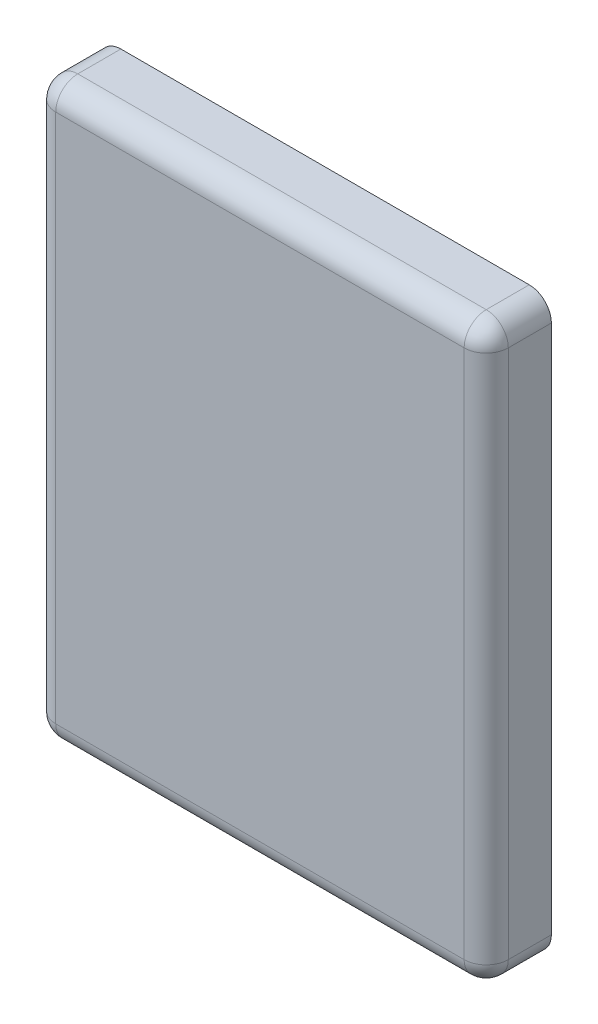
ISO-10303-21;
HEADER;
FILE_DESCRIPTION(('STEP AP214'),'2;1');
FILE_NAME('part.step','',(''),(''),'','','');
FILE_SCHEMA(('AUTOMOTIVE_DESIGN { 1 0 10303 214 1 1 1 1 }'));
ENDSEC;
DATA;
#1=APPLICATION_CONTEXT('core data for automotive mechanical design processes');
#2=APPLICATION_PROTOCOL_DEFINITION('international standard','automotive_design',2000,#1);
#3=PRODUCT_CONTEXT('',#1,'mechanical');
#4=PRODUCT('Part','Part','',(#3));
#5=PRODUCT_RELATED_PRODUCT_CATEGORY('part','',(#4));
#6=PRODUCT_DEFINITION_FORMATION('','',#4);
#7=PRODUCT_DEFINITION_CONTEXT('part definition',#1,'design');
#8=PRODUCT_DEFINITION('design','',#6,#7);
#9=PRODUCT_DEFINITION_SHAPE('','',#8);
#10=(LENGTH_UNIT() NAMED_UNIT(*) SI_UNIT(.MILLI.,.METRE.));
#11=(NAMED_UNIT(*) PLANE_ANGLE_UNIT() SI_UNIT($,.RADIAN.));
#12=(NAMED_UNIT(*) SI_UNIT($,.STERADIAN.) SOLID_ANGLE_UNIT());
#13=UNCERTAINTY_MEASURE_WITH_UNIT(LENGTH_MEASURE(1.E-05),#10,'distance_accuracy_value','');
#14=(GEOMETRIC_REPRESENTATION_CONTEXT(3) GLOBAL_UNCERTAINTY_ASSIGNED_CONTEXT((#13)) GLOBAL_UNIT_ASSIGNED_CONTEXT((#10,
#11,#12)) REPRESENTATION_CONTEXT('',''));
#15=CARTESIAN_POINT('',(0.,0.,0.));
#16=DIRECTION('',(0.,0.,1.));
#17=DIRECTION('',(1.,0.,0.));
#18=AXIS2_PLACEMENT_3D('',#15,#16,#17);
#19=CARTESIAN_POINT('',(205.,260.,9.));
#20=DIRECTION('',(0.,-1.,0.));
#21=DIRECTION('',(0.,0.,-1.));
#22=AXIS2_PLACEMENT_3D('',#19,#20,#21);
#23=PLANE('',#22);
#24=DIRECTION('',(-1.,0.,0.));
#25=VECTOR('',#24,1.);
#26=CARTESIAN_POINT('',(205.,260.,0.));
#27=LINE('',#26,#25);
#28=CARTESIAN_POINT('',(185.,260.,0.));
#29=VERTEX_POINT('',#28);
#30=CARTESIAN_POINT('',(-185.,260.,0.));
#31=VERTEX_POINT('',#30);
#32=EDGE_CURVE('E151',#29,#31,#27,.T.);
#33=ORIENTED_EDGE('',*,*,#32,.T.);
#34=DIRECTION('',(0.,0.,-1.));
#35=VECTOR('',#34,1.);
#36=CARTESIAN_POINT('',(-185.,260.,9.));
#37=LINE('',#36,#35);
#38=CARTESIAN_POINT('',(-185.,260.,39.));
#39=VERTEX_POINT('',#38);
#40=EDGE_CURVE('E166',#31,#39,#37,.F.);
#41=ORIENTED_EDGE('',*,*,#40,.T.);
#42=DIRECTION('',(-1.,0.,0.));
#43=VECTOR('',#42,1.);
#44=CARTESIAN_POINT('',(205.,260.,39.));
#45=LINE('',#44,#43);
#46=CARTESIAN_POINT('',(185.,260.,39.));
#47=VERTEX_POINT('',#46);
#48=EDGE_CURVE('E170',#39,#47,#45,.F.);
#49=ORIENTED_EDGE('',*,*,#48,.T.);
#50=DIRECTION('',(0.,0.,-1.));
#51=VECTOR('',#50,1.);
#52=CARTESIAN_POINT('',(185.,260.,9.));
#53=LINE('',#52,#51);
#54=EDGE_CURVE('E164',#47,#29,#53,.T.);
#55=ORIENTED_EDGE('',*,*,#54,.T.);
#56=EDGE_LOOP('',(#33,#41,#49,#55));
#57=FACE_BOUND('',#56,.T.);
#58=ADVANCED_FACE('F43',(#57),#23,.F.);
#59=CARTESIAN_POINT('',(-205.,-260.,9.));
#60=DIRECTION('',(1.,0.,0.));
#61=DIRECTION('',(0.,0.,-1.));
#62=AXIS2_PLACEMENT_3D('',#59,#60,#61);
#63=PLANE('',#62);
#64=DIRECTION('',(0.,-1.,0.));
#65=VECTOR('',#64,1.);
#66=CARTESIAN_POINT('',(-205.,-260.,0.));
#67=LINE('',#66,#65);
#68=CARTESIAN_POINT('',(-205.,240.,0.));
#69=VERTEX_POINT('',#68);
#70=CARTESIAN_POINT('',(-205.,-240.,0.));
#71=VERTEX_POINT('',#70);
#72=EDGE_CURVE('E150',#69,#71,#67,.T.);
#73=ORIENTED_EDGE('',*,*,#72,.T.);
#74=DIRECTION('',(0.,0.,-1.));
#75=VECTOR('',#74,1.);
#76=CARTESIAN_POINT('',(-205.,-240.,9.));
#77=LINE('',#76,#75);
#78=CARTESIAN_POINT('',(-205.,-240.,39.));
#79=VERTEX_POINT('',#78);
#80=EDGE_CURVE('E122',#71,#79,#77,.F.);
#81=ORIENTED_EDGE('',*,*,#80,.T.);
#82=DIRECTION('',(0.,-1.,0.));
#83=VECTOR('',#82,1.);
#84=CARTESIAN_POINT('',(-205.,260.,39.));
#85=LINE('',#84,#83);
#86=CARTESIAN_POINT('',(-205.,240.,39.));
#87=VERTEX_POINT('',#86);
#88=EDGE_CURVE('E128',#79,#87,#85,.F.);
#89=ORIENTED_EDGE('',*,*,#88,.T.);
#90=DIRECTION('',(0.,0.,-1.));
#91=VECTOR('',#90,1.);
#92=CARTESIAN_POINT('',(-205.,240.,9.));
#93=LINE('',#92,#91);
#94=EDGE_CURVE('E165',#87,#69,#93,.T.);
#95=ORIENTED_EDGE('',*,*,#94,.T.);
#96=EDGE_LOOP('',(#73,#81,#89,#95));
#97=FACE_BOUND('',#96,.T.);
#98=ADVANCED_FACE('F256',(#97),#63,.F.);
#99=CARTESIAN_POINT('',(205.,-260.,9.));
#100=DIRECTION('',(0.,1.,0.));
#101=DIRECTION('',(0.,0.,1.));
#102=AXIS2_PLACEMENT_3D('',#99,#100,#101);
#103=PLANE('',#102);
#104=DIRECTION('',(1.,0.,0.));
#105=VECTOR('',#104,1.);
#106=CARTESIAN_POINT('',(-205.,-260.,39.));
#107=LINE('',#106,#105);
#108=CARTESIAN_POINT('',(185.,-260.,39.));
#109=VERTEX_POINT('',#108);
#110=CARTESIAN_POINT('',(-185.,-260.,39.));
#111=VERTEX_POINT('',#110);
#112=EDGE_CURVE('E138',#109,#111,#107,.F.);
#113=ORIENTED_EDGE('',*,*,#112,.T.);
#114=DIRECTION('',(0.,0.,-1.));
#115=VECTOR('',#114,1.);
#116=CARTESIAN_POINT('',(-185.,-260.,9.));
#117=LINE('',#116,#115);
#118=CARTESIAN_POINT('',(-185.,-260.,0.));
#119=VERTEX_POINT('',#118);
#120=EDGE_CURVE('E123',#111,#119,#117,.T.);
#121=ORIENTED_EDGE('',*,*,#120,.T.);
#122=DIRECTION('',(1.,0.,0.));
#123=VECTOR('',#122,1.);
#124=CARTESIAN_POINT('',(205.,-260.,0.));
#125=LINE('',#124,#123);
#126=CARTESIAN_POINT('',(185.,-260.,0.));
#127=VERTEX_POINT('',#126);
#128=EDGE_CURVE('E139',#119,#127,#125,.T.);
#129=ORIENTED_EDGE('',*,*,#128,.T.);
#130=DIRECTION('',(0.,0.,-1.));
#131=VECTOR('',#130,1.);
#132=CARTESIAN_POINT('',(185.,-260.,9.));
#133=LINE('',#132,#131);
#134=EDGE_CURVE('E149',#127,#109,#133,.F.);
#135=ORIENTED_EDGE('',*,*,#134,.T.);
#136=EDGE_LOOP('',(#113,#121,#129,#135));
#137=FACE_BOUND('',#136,.T.);
#138=ADVANCED_FACE('F133',(#137),#103,.F.);
#139=CARTESIAN_POINT('',(205.,-260.,9.));
#140=DIRECTION('',(-1.,0.,0.));
#141=DIRECTION('',(0.,0.,1.));
#142=AXIS2_PLACEMENT_3D('',#139,#140,#141);
#143=PLANE('',#142);
#144=DIRECTION('',(0.,1.,0.));
#145=VECTOR('',#144,1.);
#146=CARTESIAN_POINT('',(205.,-260.,0.));
#147=LINE('',#146,#145);
#148=CARTESIAN_POINT('',(205.,-240.,0.));
#149=VERTEX_POINT('',#148);
#150=CARTESIAN_POINT('',(205.,240.,0.));
#151=VERTEX_POINT('',#150);
#152=EDGE_CURVE('E148',#149,#151,#147,.T.);
#153=ORIENTED_EDGE('',*,*,#152,.T.);
#154=DIRECTION('',(0.,0.,-1.));
#155=VECTOR('',#154,1.);
#156=CARTESIAN_POINT('',(205.,240.,9.));
#157=LINE('',#156,#155);
#158=CARTESIAN_POINT('',(205.,240.,39.));
#159=VERTEX_POINT('',#158);
#160=EDGE_CURVE('E11',#151,#159,#157,.F.);
#161=ORIENTED_EDGE('',*,*,#160,.T.);
#162=DIRECTION('',(0.,1.,0.));
#163=VECTOR('',#162,1.);
#164=CARTESIAN_POINT('',(205.,-260.,39.));
#165=LINE('',#164,#163);
#166=CARTESIAN_POINT('',(205.,-240.,39.));
#167=VERTEX_POINT('',#166);
#168=EDGE_CURVE('E56',#159,#167,#165,.F.);
#169=ORIENTED_EDGE('',*,*,#168,.T.);
#170=DIRECTION('',(0.,0.,-1.));
#171=VECTOR('',#170,1.);
#172=CARTESIAN_POINT('',(205.,-240.,9.));
#173=LINE('',#172,#171);
#174=EDGE_CURVE('E55',#167,#149,#173,.T.);
#175=ORIENTED_EDGE('',*,*,#174,.T.);
#176=EDGE_LOOP('',(#153,#161,#169,#175));
#177=FACE_BOUND('',#176,.T.);
#178=ADVANCED_FACE('F237',(#177),#143,.F.);
#179=CARTESIAN_POINT('',(0.,0.,0.));
#180=DIRECTION('',(0.,0.,-1.));
#181=DIRECTION('',(-1.,0.,0.));
#182=AXIS2_PLACEMENT_3D('',#179,#180,#181);
#183=PLANE('',#182);
#184=ORIENTED_EDGE('',*,*,#128,.F.);
#185=CARTESIAN_POINT('',(-185.,-240.,0.));
#186=DIRECTION('',(0.,0.,-1.));
#187=DIRECTION('',(-1.,0.,0.));
#188=AXIS2_PLACEMENT_3D('',#185,#186,#187);
#189=CIRCLE('',#188,20.);
#190=EDGE_CURVE('E118',#119,#71,#189,.T.);
#191=ORIENTED_EDGE('',*,*,#190,.T.);
#192=ORIENTED_EDGE('',*,*,#72,.F.);
#193=CARTESIAN_POINT('',(-185.,240.,0.));
#194=DIRECTION('',(0.,0.,-1.));
#195=DIRECTION('',(-1.,0.,0.));
#196=AXIS2_PLACEMENT_3D('',#193,#194,#195);
#197=CIRCLE('',#196,20.);
#198=EDGE_CURVE('E132',#69,#31,#197,.T.);
#199=ORIENTED_EDGE('',*,*,#198,.T.);
#200=ORIENTED_EDGE('',*,*,#32,.F.);
#201=CARTESIAN_POINT('',(185.,240.,0.));
#202=DIRECTION('',(0.,0.,-1.));
#203=DIRECTION('',(-1.,0.,0.));
#204=AXIS2_PLACEMENT_3D('',#201,#202,#203);
#205=CIRCLE('',#204,20.);
#206=EDGE_CURVE('E158',#29,#151,#205,.T.);
#207=ORIENTED_EDGE('',*,*,#206,.T.);
#208=ORIENTED_EDGE('',*,*,#152,.F.);
#209=CARTESIAN_POINT('',(185.,-240.,0.));
#210=DIRECTION('',(0.,0.,-1.));
#211=DIRECTION('',(-1.,0.,0.));
#212=AXIS2_PLACEMENT_3D('',#209,#210,#211);
#213=CIRCLE('',#212,20.);
#214=EDGE_CURVE('E143',#149,#127,#213,.T.);
#215=ORIENTED_EDGE('',*,*,#214,.T.);
#216=EDGE_LOOP('',(#184,#191,#192,#199,#200,#207,#208,#215));
#217=FACE_BOUND('',#216,.T.);
#218=ADVANCED_FACE('F141',(#217),#183,.T.);
#219=CARTESIAN_POINT('',(0.,0.,59.));
#220=DIRECTION('',(0.,0.,1.));
#221=DIRECTION('',(1.,0.,0.));
#222=AXIS2_PLACEMENT_3D('',#219,#220,#221);
#223=PLANE('',#222);
#224=DIRECTION('',(-1.,0.,0.));
#225=VECTOR('',#224,1.);
#226=CARTESIAN_POINT('',(-205.,240.,59.));
#227=LINE('',#226,#225);
#228=CARTESIAN_POINT('',(185.,240.,59.));
#229=VERTEX_POINT('',#228);
#230=CARTESIAN_POINT('',(-185.,240.,59.));
#231=VERTEX_POINT('',#230);
#232=EDGE_CURVE('E174',#229,#231,#227,.T.);
#233=ORIENTED_EDGE('',*,*,#232,.T.);
#234=DIRECTION('',(0.,-1.,0.));
#235=VECTOR('',#234,1.);
#236=CARTESIAN_POINT('',(-185.,-260.,59.));
#237=LINE('',#236,#235);
#238=CARTESIAN_POINT('',(-185.,-240.,59.));
#239=VERTEX_POINT('',#238);
#240=EDGE_CURVE('E176',#231,#239,#237,.T.);
#241=ORIENTED_EDGE('',*,*,#240,.T.);
#242=DIRECTION('',(1.,0.,0.));
#243=VECTOR('',#242,1.);
#244=CARTESIAN_POINT('',(205.,-240.,59.));
#245=LINE('',#244,#243);
#246=CARTESIAN_POINT('',(185.,-240.,59.));
#247=VERTEX_POINT('',#246);
#248=EDGE_CURVE('E173',#239,#247,#245,.T.);
#249=ORIENTED_EDGE('',*,*,#248,.T.);
#250=DIRECTION('',(0.,1.,0.));
#251=VECTOR('',#250,1.);
#252=CARTESIAN_POINT('',(185.,260.,59.));
#253=LINE('',#252,#251);
#254=EDGE_CURVE('E172',#247,#229,#253,.T.);
#255=ORIENTED_EDGE('',*,*,#254,.T.);
#256=EDGE_LOOP('',(#233,#241,#249,#255));
#257=FACE_BOUND('',#256,.T.);
#258=ADVANCED_FACE('F291',(#257),#223,.T.);
#259=CARTESIAN_POINT('',(185.,240.,9.));
#260=DIRECTION('',(0.,0.,-1.));
#261=DIRECTION('',(-1.,0.,0.));
#262=AXIS2_PLACEMENT_3D('',#259,#260,#261);
#263=CYLINDRICAL_SURFACE('',#262,20.);
#264=CARTESIAN_POINT('',(185.,240.,39.));
#265=DIRECTION('',(0.,0.,1.));
#266=DIRECTION('',(1.,0.,0.));
#267=AXIS2_PLACEMENT_3D('',#264,#265,#266);
#268=CIRCLE('',#267,20.);
#269=EDGE_CURVE('E50',#159,#47,#268,.T.);
#270=ORIENTED_EDGE('',*,*,#269,.F.);
#271=ORIENTED_EDGE('',*,*,#160,.F.);
#272=ORIENTED_EDGE('',*,*,#206,.F.);
#273=ORIENTED_EDGE('',*,*,#54,.F.);
#274=EDGE_LOOP('',(#270,#271,#272,#273));
#275=FACE_BOUND('',#274,.T.);
#276=ADVANCED_FACE('F44',(#275),#263,.T.);
#277=CARTESIAN_POINT('',(185.,240.,39.));
#278=DIRECTION('',(0.,1.,0.));
#279=DIRECTION('',(0.,0.,1.));
#280=AXIS2_PLACEMENT_3D('',#277,#278,#279);
#281=SPHERICAL_SURFACE('',#280,20.);
#282=CARTESIAN_POINT('',(185.,240.,39.));
#283=DIRECTION('',(0.,1.,0.));
#284=DIRECTION('',(0.,0.,1.));
#285=AXIS2_PLACEMENT_3D('',#282,#283,#284);
#286=CIRCLE('',#285,20.);
#287=EDGE_CURVE('E210',#159,#229,#286,.F.);
#288=ORIENTED_EDGE('',*,*,#287,.F.);
#289=ORIENTED_EDGE('',*,*,#269,.T.);
#290=CARTESIAN_POINT('',(185.,240.,39.));
#291=DIRECTION('',(1.,0.,0.));
#292=DIRECTION('',(0.,0.,-1.));
#293=AXIS2_PLACEMENT_3D('',#290,#291,#292);
#294=CIRCLE('',#293,20.);
#295=EDGE_CURVE('E207',#229,#47,#294,.F.);
#296=ORIENTED_EDGE('',*,*,#295,.F.);
#297=EDGE_LOOP('',(#288,#289,#296));
#298=FACE_BOUND('',#297,.T.);
#299=ADVANCED_FACE('F290',(#298),#281,.T.);
#300=CARTESIAN_POINT('',(-185.,240.,9.));
#301=DIRECTION('',(0.,0.,-1.));
#302=DIRECTION('',(-1.,0.,0.));
#303=AXIS2_PLACEMENT_3D('',#300,#301,#302);
#304=CYLINDRICAL_SURFACE('',#303,20.);
#305=ORIENTED_EDGE('',*,*,#198,.F.);
#306=ORIENTED_EDGE('',*,*,#94,.F.);
#307=CARTESIAN_POINT('',(-185.,240.,39.));
#308=DIRECTION('',(0.,0.,1.));
#309=DIRECTION('',(1.,0.,0.));
#310=AXIS2_PLACEMENT_3D('',#307,#308,#309);
#311=CIRCLE('',#310,20.);
#312=EDGE_CURVE('E204',#39,#87,#311,.T.);
#313=ORIENTED_EDGE('',*,*,#312,.F.);
#314=ORIENTED_EDGE('',*,*,#40,.F.);
#315=EDGE_LOOP('',(#305,#306,#313,#314));
#316=FACE_BOUND('',#315,.T.);
#317=ADVANCED_FACE('F230',(#316),#304,.T.);
#318=CARTESIAN_POINT('',(0.,240.,39.));
#319=DIRECTION('',(1.,0.,0.));
#320=DIRECTION('',(0.,0.,-1.));
#321=AXIS2_PLACEMENT_3D('',#318,#319,#320);
#322=CYLINDRICAL_SURFACE('',#321,20.);
#323=ORIENTED_EDGE('',*,*,#295,.T.);
#324=ORIENTED_EDGE('',*,*,#48,.F.);
#325=CARTESIAN_POINT('',(-185.,240.,39.));
#326=DIRECTION('',(-1.,0.,0.));
#327=DIRECTION('',(0.,0.,1.));
#328=AXIS2_PLACEMENT_3D('',#325,#326,#327);
#329=CIRCLE('',#328,20.);
#330=EDGE_CURVE('E203',#231,#39,#329,.T.);
#331=ORIENTED_EDGE('',*,*,#330,.F.);
#332=ORIENTED_EDGE('',*,*,#232,.F.);
#333=EDGE_LOOP('',(#323,#324,#331,#332));
#334=FACE_BOUND('',#333,.T.);
#335=ADVANCED_FACE('F233',(#334),#322,.T.);
#336=CARTESIAN_POINT('',(185.,0.,39.));
#337=DIRECTION('',(0.,-1.,0.));
#338=DIRECTION('',(0.,0.,-1.));
#339=AXIS2_PLACEMENT_3D('',#336,#337,#338);
#340=CYLINDRICAL_SURFACE('',#339,20.);
#341=ORIENTED_EDGE('',*,*,#287,.T.);
#342=ORIENTED_EDGE('',*,*,#254,.F.);
#343=CARTESIAN_POINT('',(185.,-240.,39.));
#344=DIRECTION('',(0.,-1.,0.));
#345=DIRECTION('',(0.,0.,-1.));
#346=AXIS2_PLACEMENT_3D('',#343,#344,#345);
#347=CIRCLE('',#346,20.);
#348=EDGE_CURVE('E196',#167,#247,#347,.T.);
#349=ORIENTED_EDGE('',*,*,#348,.F.);
#350=ORIENTED_EDGE('',*,*,#168,.F.);
#351=EDGE_LOOP('',(#341,#342,#349,#350));
#352=FACE_BOUND('',#351,.T.);
#353=ADVANCED_FACE('F241',(#352),#340,.T.);
#354=CARTESIAN_POINT('',(185.,-240.,9.));
#355=DIRECTION('',(0.,0.,-1.));
#356=DIRECTION('',(-1.,0.,0.));
#357=AXIS2_PLACEMENT_3D('',#354,#355,#356);
#358=CYLINDRICAL_SURFACE('',#357,20.);
#359=ORIENTED_EDGE('',*,*,#214,.F.);
#360=ORIENTED_EDGE('',*,*,#174,.F.);
#361=CARTESIAN_POINT('',(185.,-240.,39.));
#362=DIRECTION('',(0.,0.,1.));
#363=DIRECTION('',(1.,0.,0.));
#364=AXIS2_PLACEMENT_3D('',#361,#362,#363);
#365=CIRCLE('',#364,20.);
#366=EDGE_CURVE('E192',#109,#167,#365,.T.);
#367=ORIENTED_EDGE('',*,*,#366,.F.);
#368=ORIENTED_EDGE('',*,*,#134,.F.);
#369=EDGE_LOOP('',(#359,#360,#367,#368));
#370=FACE_BOUND('',#369,.T.);
#371=ADVANCED_FACE('F238',(#370),#358,.T.);
#372=CARTESIAN_POINT('',(-185.,240.,39.));
#373=DIRECTION('',(0.,1.,0.));
#374=DIRECTION('',(0.,0.,1.));
#375=AXIS2_PLACEMENT_3D('',#372,#373,#374);
#376=SPHERICAL_SURFACE('',#375,20.);
#377=ORIENTED_EDGE('',*,*,#330,.T.);
#378=ORIENTED_EDGE('',*,*,#312,.T.);
#379=CARTESIAN_POINT('',(-185.,240.,39.));
#380=DIRECTION('',(0.,1.,0.));
#381=DIRECTION('',(0.,0.,1.));
#382=AXIS2_PLACEMENT_3D('',#379,#380,#381);
#383=CIRCLE('',#382,20.);
#384=EDGE_CURVE('E191',#231,#87,#383,.F.);
#385=ORIENTED_EDGE('',*,*,#384,.F.);
#386=EDGE_LOOP('',(#377,#378,#385));
#387=FACE_BOUND('',#386,.T.);
#388=ADVANCED_FACE('F231',(#387),#376,.T.);
#389=CARTESIAN_POINT('',(185.,-240.,39.));
#390=DIRECTION('',(1.,0.,0.));
#391=DIRECTION('',(0.,0.,-1.));
#392=AXIS2_PLACEMENT_3D('',#389,#390,#391);
#393=SPHERICAL_SURFACE('',#392,20.);
#394=ORIENTED_EDGE('',*,*,#366,.T.);
#395=ORIENTED_EDGE('',*,*,#348,.T.);
#396=CARTESIAN_POINT('',(185.,-240.,39.));
#397=DIRECTION('',(1.,0.,0.));
#398=DIRECTION('',(0.,0.,-1.));
#399=AXIS2_PLACEMENT_3D('',#396,#397,#398);
#400=CIRCLE('',#399,20.);
#401=EDGE_CURVE('E186',#109,#247,#400,.F.);
#402=ORIENTED_EDGE('',*,*,#401,.F.);
#403=EDGE_LOOP('',(#394,#395,#402));
#404=FACE_BOUND('',#403,.T.);
#405=ADVANCED_FACE('F249',(#404),#393,.T.);
#406=CARTESIAN_POINT('',(-185.,0.,39.));
#407=DIRECTION('',(0.,1.,0.));
#408=DIRECTION('',(0.,0.,1.));
#409=AXIS2_PLACEMENT_3D('',#406,#407,#408);
#410=CYLINDRICAL_SURFACE('',#409,20.);
#411=ORIENTED_EDGE('',*,*,#384,.T.);
#412=ORIENTED_EDGE('',*,*,#88,.F.);
#413=CARTESIAN_POINT('',(-185.,-240.,39.));
#414=DIRECTION('',(0.,-1.,0.));
#415=DIRECTION('',(0.,0.,-1.));
#416=AXIS2_PLACEMENT_3D('',#413,#414,#415);
#417=CIRCLE('',#416,20.);
#418=EDGE_CURVE('E187',#239,#79,#417,.T.);
#419=ORIENTED_EDGE('',*,*,#418,.F.);
#420=ORIENTED_EDGE('',*,*,#240,.F.);
#421=EDGE_LOOP('',(#411,#412,#419,#420));
#422=FACE_BOUND('',#421,.T.);
#423=ADVANCED_FACE('F258',(#422),#410,.T.);
#424=CARTESIAN_POINT('',(0.,-240.,39.));
#425=DIRECTION('',(-1.,0.,0.));
#426=DIRECTION('',(0.,0.,1.));
#427=AXIS2_PLACEMENT_3D('',#424,#425,#426);
#428=CYLINDRICAL_SURFACE('',#427,20.);
#429=ORIENTED_EDGE('',*,*,#401,.T.);
#430=ORIENTED_EDGE('',*,*,#248,.F.);
#431=CARTESIAN_POINT('',(-185.,-240.,39.));
#432=DIRECTION('',(-1.,0.,0.));
#433=DIRECTION('',(0.,0.,1.));
#434=AXIS2_PLACEMENT_3D('',#431,#432,#433);
#435=CIRCLE('',#434,20.);
#436=EDGE_CURVE('E184',#111,#239,#435,.T.);
#437=ORIENTED_EDGE('',*,*,#436,.F.);
#438=ORIENTED_EDGE('',*,*,#112,.F.);
#439=EDGE_LOOP('',(#429,#430,#437,#438));
#440=FACE_BOUND('',#439,.T.);
#441=ADVANCED_FACE('F248',(#440),#428,.T.);
#442=CARTESIAN_POINT('',(-185.,-240.,39.));
#443=DIRECTION('',(0.,0.,1.));
#444=DIRECTION('',(1.,0.,0.));
#445=AXIS2_PLACEMENT_3D('',#442,#443,#444);
#446=SPHERICAL_SURFACE('',#445,20.);
#447=ORIENTED_EDGE('',*,*,#436,.T.);
#448=ORIENTED_EDGE('',*,*,#418,.T.);
#449=CARTESIAN_POINT('',(-185.,-240.,39.));
#450=DIRECTION('',(0.,0.,1.));
#451=DIRECTION('',(1.,0.,0.));
#452=AXIS2_PLACEMENT_3D('',#449,#450,#451);
#453=CIRCLE('',#452,20.);
#454=EDGE_CURVE('E185',#111,#79,#453,.F.);
#455=ORIENTED_EDGE('',*,*,#454,.F.);
#456=EDGE_LOOP('',(#447,#448,#455));
#457=FACE_BOUND('',#456,.T.);
#458=ADVANCED_FACE('F251',(#457),#446,.T.);
#459=CARTESIAN_POINT('',(-185.,-240.,9.));
#460=DIRECTION('',(0.,0.,-1.));
#461=DIRECTION('',(-1.,0.,0.));
#462=AXIS2_PLACEMENT_3D('',#459,#460,#461);
#463=CYLINDRICAL_SURFACE('',#462,20.);
#464=ORIENTED_EDGE('',*,*,#454,.T.);
#465=ORIENTED_EDGE('',*,*,#80,.F.);
#466=ORIENTED_EDGE('',*,*,#190,.F.);
#467=ORIENTED_EDGE('',*,*,#120,.F.);
#468=EDGE_LOOP('',(#464,#465,#466,#467));
#469=FACE_BOUND('',#468,.T.);
#470=ADVANCED_FACE('F125',(#469),#463,.T.);
#471=CLOSED_SHELL('',(#58,#98,#138,#178,#218,#258,#276,#299,#317,#335,#353,#371,#388,#405,#423,
#441,#458,#470));
#472=MANIFOLD_SOLID_BREP('B2',#471);
#473=ADVANCED_BREP_SHAPE_REPRESENTATION('',(#18,#472),#14);
#474=SHAPE_DEFINITION_REPRESENTATION(#9,#473);
ENDSEC;
END-ISO-10303-21;
